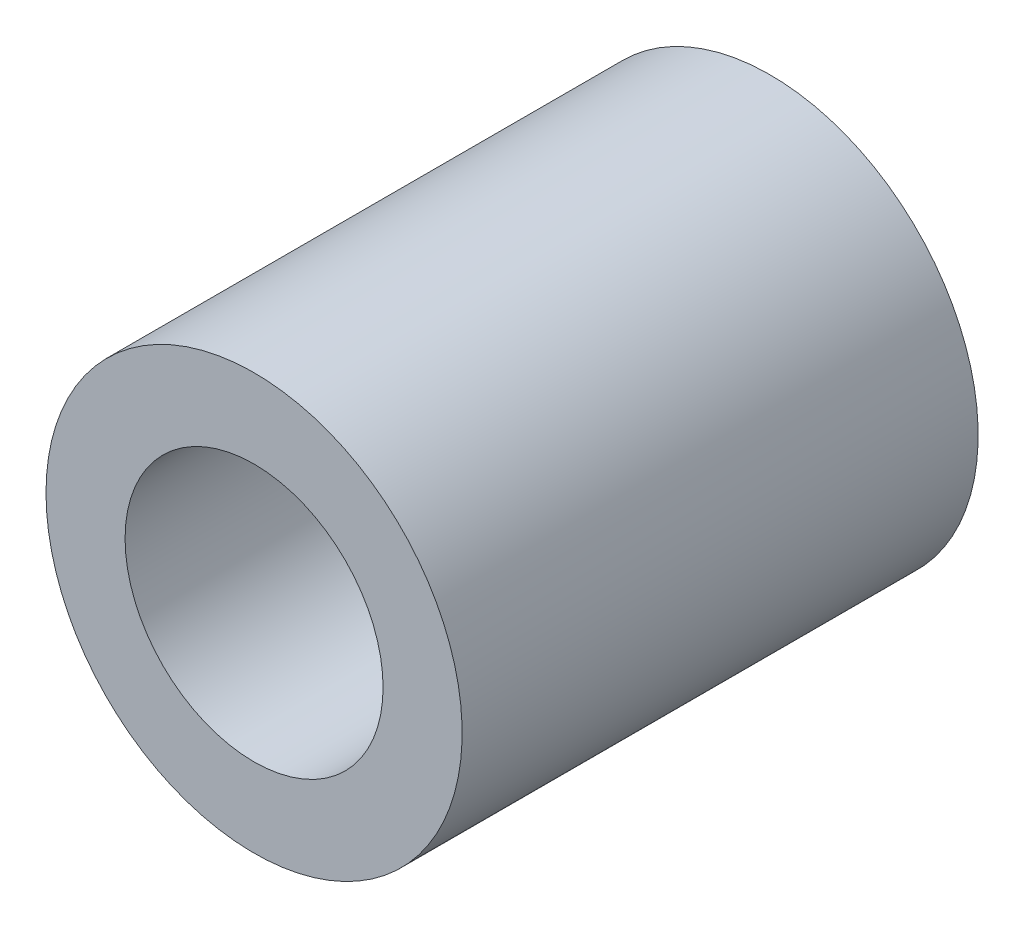
ISO-10303-21;
HEADER;
FILE_DESCRIPTION(('STEP AP214'),'2;1');
FILE_NAME('part.step','',(''),(''),'','','');
FILE_SCHEMA(('AUTOMOTIVE_DESIGN { 1 0 10303 214 1 1 1 1 }'));
ENDSEC;
DATA;
#1=APPLICATION_CONTEXT('core data for automotive mechanical design processes');
#2=APPLICATION_PROTOCOL_DEFINITION('international standard','automotive_design',2000,#1);
#3=PRODUCT_CONTEXT('',#1,'mechanical');
#4=PRODUCT('Part','Part','',(#3));
#5=PRODUCT_RELATED_PRODUCT_CATEGORY('part','',(#4));
#6=PRODUCT_DEFINITION_FORMATION('','',#4);
#7=PRODUCT_DEFINITION_CONTEXT('part definition',#1,'design');
#8=PRODUCT_DEFINITION('design','',#6,#7);
#9=PRODUCT_DEFINITION_SHAPE('','',#8);
#10=(LENGTH_UNIT() NAMED_UNIT(*) SI_UNIT(.MILLI.,.METRE.));
#11=(NAMED_UNIT(*) PLANE_ANGLE_UNIT() SI_UNIT($,.RADIAN.));
#12=(NAMED_UNIT(*) SI_UNIT($,.STERADIAN.) SOLID_ANGLE_UNIT());
#13=UNCERTAINTY_MEASURE_WITH_UNIT(LENGTH_MEASURE(1.E-05),#10,'distance_accuracy_value','');
#14=(GEOMETRIC_REPRESENTATION_CONTEXT(3) GLOBAL_UNCERTAINTY_ASSIGNED_CONTEXT((#13)) GLOBAL_UNIT_ASSIGNED_CONTEXT((#10,
#11,#12)) REPRESENTATION_CONTEXT('',''));
#15=CARTESIAN_POINT('',(0.,0.,0.));
#16=DIRECTION('',(0.,0.,1.));
#17=DIRECTION('',(1.,0.,0.));
#18=AXIS2_PLACEMENT_3D('',#15,#16,#17);
#19=CARTESIAN_POINT('',(0.,0.,6.2));
#20=DIRECTION('',(0.,0.,1.));
#21=DIRECTION('',(1.,0.,0.));
#22=AXIS2_PLACEMENT_3D('',#19,#20,#21);
#23=PLANE('',#22);
#24=CARTESIAN_POINT('',(0.,0.,6.2));
#25=DIRECTION('',(0.,0.,1.));
#26=DIRECTION('',(1.,0.,0.));
#27=AXIS2_PLACEMENT_3D('',#24,#25,#26);
#28=CIRCLE('',#27,2.5);
#29=CARTESIAN_POINT('',(-2.5,0.,6.2));
#30=VERTEX_POINT('',#29);
#31=EDGE_CURVE('E10',#30,#30,#28,.T.);
#32=ORIENTED_EDGE('',*,*,#31,.T.);
#33=EDGE_LOOP('',(#32));
#34=FACE_BOUND('',#33,.T.);
#35=CARTESIAN_POINT('',(0.,0.,6.2));
#36=DIRECTION('',(0.,0.,1.));
#37=DIRECTION('',(1.,0.,0.));
#38=AXIS2_PLACEMENT_3D('',#35,#36,#37);
#39=CIRCLE('',#38,1.55);
#40=CARTESIAN_POINT('',(-1.55,0.,6.2));
#41=VERTEX_POINT('',#40);
#42=EDGE_CURVE('E50',#41,#41,#39,.T.);
#43=ORIENTED_EDGE('',*,*,#42,.F.);
#44=EDGE_LOOP('',(#43));
#45=FACE_BOUND('',#44,.T.);
#46=ADVANCED_FACE('F37',(#34,#45),#23,.T.);
#47=CARTESIAN_POINT('',(0.,0.,0.));
#48=DIRECTION('',(0.,0.,1.));
#49=DIRECTION('',(1.,0.,0.));
#50=AXIS2_PLACEMENT_3D('',#47,#48,#49);
#51=PLANE('',#50);
#52=CARTESIAN_POINT('',(0.,0.,0.));
#53=DIRECTION('',(0.,0.,1.));
#54=DIRECTION('',(1.,0.,0.));
#55=AXIS2_PLACEMENT_3D('',#52,#53,#54);
#56=CIRCLE('',#55,2.5);
#57=CARTESIAN_POINT('',(-2.5,0.,0.));
#58=VERTEX_POINT('',#57);
#59=EDGE_CURVE('E41',#58,#58,#56,.T.);
#60=ORIENTED_EDGE('',*,*,#59,.F.);
#61=EDGE_LOOP('',(#60));
#62=FACE_BOUND('',#61,.T.);
#63=CARTESIAN_POINT('',(0.,0.,0.));
#64=DIRECTION('',(0.,0.,1.));
#65=DIRECTION('',(1.,0.,0.));
#66=AXIS2_PLACEMENT_3D('',#63,#64,#65);
#67=CIRCLE('',#66,1.55);
#68=CARTESIAN_POINT('',(-1.55,0.,0.));
#69=VERTEX_POINT('',#68);
#70=EDGE_CURVE('E52',#69,#69,#67,.T.);
#71=ORIENTED_EDGE('',*,*,#70,.T.);
#72=EDGE_LOOP('',(#71));
#73=FACE_BOUND('',#72,.T.);
#74=ADVANCED_FACE('F64',(#62,#73),#51,.F.);
#75=CARTESIAN_POINT('',(0.,0.,6.2));
#76=DIRECTION('',(0.,0.,-1.));
#77=DIRECTION('',(-1.,0.,0.));
#78=AXIS2_PLACEMENT_3D('',#75,#76,#77);
#79=CYLINDRICAL_SURFACE('',#78,2.5);
#80=CARTESIAN_POINT('',(-2.5,0.,6.2));
#81=CARTESIAN_POINT('',(-2.5,0.,6.13541666666667));
#82=CARTESIAN_POINT('',(-2.5,0.,6.07083333333333));
#83=CARTESIAN_POINT('',(-2.5,0.,5.94166666666667));
#84=CARTESIAN_POINT('',(-2.5,0.,5.87708333333333));
#85=CARTESIAN_POINT('',(-2.5,0.,5.74791666666667));
#86=CARTESIAN_POINT('',(-2.5,0.,5.68333333333333));
#87=CARTESIAN_POINT('',(-2.5,0.,5.55416666666667));
#88=CARTESIAN_POINT('',(-2.5,0.,5.48958333333333));
#89=CARTESIAN_POINT('',(-2.5,0.,5.36041666666667));
#90=CARTESIAN_POINT('',(-2.5,0.,5.29583333333333));
#91=CARTESIAN_POINT('',(-2.5,0.,5.16666666666667));
#92=CARTESIAN_POINT('',(-2.5,0.,5.10208333333333));
#93=CARTESIAN_POINT('',(-2.5,0.,4.97291666666667));
#94=CARTESIAN_POINT('',(-2.5,0.,4.90833333333333));
#95=CARTESIAN_POINT('',(-2.5,0.,4.77916666666667));
#96=CARTESIAN_POINT('',(-2.5,0.,4.71458333333333));
#97=CARTESIAN_POINT('',(-2.5,0.,4.58541666666667));
#98=CARTESIAN_POINT('',(-2.5,0.,4.52083333333333));
#99=CARTESIAN_POINT('',(-2.5,0.,4.39166666666667));
#100=CARTESIAN_POINT('',(-2.5,0.,4.32708333333333));
#101=CARTESIAN_POINT('',(-2.5,0.,4.19791666666667));
#102=CARTESIAN_POINT('',(-2.5,0.,4.13333333333333));
#103=CARTESIAN_POINT('',(-2.5,0.,4.00416666666667));
#104=CARTESIAN_POINT('',(-2.5,0.,3.93958333333333));
#105=CARTESIAN_POINT('',(-2.5,0.,3.81041666666667));
#106=CARTESIAN_POINT('',(-2.5,0.,3.74583333333333));
#107=CARTESIAN_POINT('',(-2.5,0.,3.61666666666667));
#108=CARTESIAN_POINT('',(-2.5,0.,3.55208333333333));
#109=CARTESIAN_POINT('',(-2.5,0.,3.42291666666667));
#110=CARTESIAN_POINT('',(-2.5,0.,3.35833333333333));
#111=CARTESIAN_POINT('',(-2.5,0.,3.22916666666667));
#112=CARTESIAN_POINT('',(-2.5,0.,3.16458333333333));
#113=CARTESIAN_POINT('',(-2.5,0.,3.03541666666667));
#114=CARTESIAN_POINT('',(-2.5,0.,2.97083333333333));
#115=CARTESIAN_POINT('',(-2.5,0.,2.84166666666667));
#116=CARTESIAN_POINT('',(-2.5,0.,2.77708333333333));
#117=CARTESIAN_POINT('',(-2.5,0.,2.64791666666667));
#118=CARTESIAN_POINT('',(-2.5,0.,2.58333333333333));
#119=CARTESIAN_POINT('',(-2.5,0.,2.45416666666667));
#120=CARTESIAN_POINT('',(-2.5,0.,2.38958333333333));
#121=CARTESIAN_POINT('',(-2.5,0.,2.26041666666667));
#122=CARTESIAN_POINT('',(-2.5,0.,2.19583333333333));
#123=CARTESIAN_POINT('',(-2.5,0.,2.06666666666667));
#124=CARTESIAN_POINT('',(-2.5,0.,2.00208333333333));
#125=CARTESIAN_POINT('',(-2.5,0.,1.87291666666667));
#126=CARTESIAN_POINT('',(-2.5,0.,1.80833333333333));
#127=CARTESIAN_POINT('',(-2.5,0.,1.67916666666667));
#128=CARTESIAN_POINT('',(-2.5,0.,1.61458333333333));
#129=CARTESIAN_POINT('',(-2.5,0.,1.48541666666667));
#130=CARTESIAN_POINT('',(-2.5,0.,1.42083333333333));
#131=CARTESIAN_POINT('',(-2.5,0.,1.29166666666667));
#132=CARTESIAN_POINT('',(-2.5,0.,1.22708333333333));
#133=CARTESIAN_POINT('',(-2.5,0.,1.09791666666667));
#134=CARTESIAN_POINT('',(-2.5,0.,1.03333333333333));
#135=CARTESIAN_POINT('',(-2.5,0.,0.904166666666667));
#136=CARTESIAN_POINT('',(-2.5,0.,0.839583333333333));
#137=CARTESIAN_POINT('',(-2.5,0.,0.710416666666666));
#138=CARTESIAN_POINT('',(-2.5,0.,0.645833333333333));
#139=CARTESIAN_POINT('',(-2.5,0.,0.516666666666667));
#140=CARTESIAN_POINT('',(-2.5,0.,0.452083333333333));
#141=CARTESIAN_POINT('',(-2.5,0.,0.322916666666667));
#142=CARTESIAN_POINT('',(-2.5,0.,0.258333333333334));
#143=CARTESIAN_POINT('',(-2.5,0.,0.129166666666667));
#144=CARTESIAN_POINT('',(-2.5,0.,0.0645833333333335));
#145=CARTESIAN_POINT('',(-2.5,0.,0.));
#146=B_SPLINE_CURVE_WITH_KNOTS('',3,(#80,#81,#82,#83,#84,#85,#86,#87,#88,#89,#90,#91,#92,#93,
#94,#95,#96,#97,#98,#99,#100,#101,#102,#103,#104,#105,#106,#107,#108,#109,#110,#111,#112,#113,
#114,#115,#116,#117,#118,#119,#120,#121,#122,#123,#124,#125,#126,#127,#128,#129,#130,#131,#132,
#133,#134,#135,#136,#137,#138,#139,#140,#141,#142,#143,#144,#145),.UNSPECIFIED.,.F.,.F.,(4,2,2,
2,2,2,2,2,2,2,2,2,2,2,2,2,2,2,2,2,2,2,2,2,2,2,2,2,2,2,2,2,4),(0.,0.193749999999999,0.3875,
0.581249999999999,0.775,0.968749999999999,1.1625,1.35625,1.55,1.74375,1.9375,2.13125,2.325,
2.51875,2.7125,2.90625,3.1,3.29375,3.4875,3.68125,3.875,4.06875,4.2625,4.45625,4.65,4.84375,
5.0375,5.23125,5.425,5.61875,5.8125,6.00625,6.2),.UNSPECIFIED.);
#147=EDGE_CURVE('BSEAM39',#30,#58,#146,.T.);
#148=ORIENTED_EDGE('',*,*,#31,.F.);
#149=ORIENTED_EDGE('',*,*,#59,.T.);
#150=ORIENTED_EDGE('',*,*,#147,.T.);
#151=ORIENTED_EDGE('',*,*,#147,.F.);
#152=EDGE_LOOP('',(#148,#150,#149,#151));
#153=FACE_BOUND('',#152,.T.);
#154=ADVANCED_FACE('F39',(#153),#79,.T.);
#155=CARTESIAN_POINT('',(0.,0.,6.2));
#156=DIRECTION('',(0.,0.,-1.));
#157=DIRECTION('',(-1.,0.,0.));
#158=AXIS2_PLACEMENT_3D('',#155,#156,#157);
#159=CYLINDRICAL_SURFACE('',#158,1.55);
#160=CARTESIAN_POINT('',(-1.55,0.,6.2));
#161=CARTESIAN_POINT('',(-1.55,0.,6.13541666666667));
#162=CARTESIAN_POINT('',(-1.55,0.,6.07083333333333));
#163=CARTESIAN_POINT('',(-1.55,0.,5.94166666666667));
#164=CARTESIAN_POINT('',(-1.55,0.,5.87708333333333));
#165=CARTESIAN_POINT('',(-1.55,0.,5.74791666666667));
#166=CARTESIAN_POINT('',(-1.55,0.,5.68333333333333));
#167=CARTESIAN_POINT('',(-1.55,0.,5.55416666666667));
#168=CARTESIAN_POINT('',(-1.55,0.,5.48958333333333));
#169=CARTESIAN_POINT('',(-1.55,0.,5.36041666666667));
#170=CARTESIAN_POINT('',(-1.55,0.,5.29583333333333));
#171=CARTESIAN_POINT('',(-1.55,0.,5.16666666666667));
#172=CARTESIAN_POINT('',(-1.55,0.,5.10208333333333));
#173=CARTESIAN_POINT('',(-1.55,0.,4.97291666666667));
#174=CARTESIAN_POINT('',(-1.55,0.,4.90833333333333));
#175=CARTESIAN_POINT('',(-1.55,0.,4.77916666666667));
#176=CARTESIAN_POINT('',(-1.55,0.,4.71458333333333));
#177=CARTESIAN_POINT('',(-1.55,0.,4.58541666666667));
#178=CARTESIAN_POINT('',(-1.55,0.,4.52083333333333));
#179=CARTESIAN_POINT('',(-1.55,0.,4.39166666666667));
#180=CARTESIAN_POINT('',(-1.55,0.,4.32708333333333));
#181=CARTESIAN_POINT('',(-1.55,0.,4.19791666666667));
#182=CARTESIAN_POINT('',(-1.55,0.,4.13333333333333));
#183=CARTESIAN_POINT('',(-1.55,0.,4.00416666666667));
#184=CARTESIAN_POINT('',(-1.55,0.,3.93958333333333));
#185=CARTESIAN_POINT('',(-1.55,0.,3.81041666666667));
#186=CARTESIAN_POINT('',(-1.55,0.,3.74583333333333));
#187=CARTESIAN_POINT('',(-1.55,0.,3.61666666666667));
#188=CARTESIAN_POINT('',(-1.55,0.,3.55208333333333));
#189=CARTESIAN_POINT('',(-1.55,0.,3.42291666666667));
#190=CARTESIAN_POINT('',(-1.55,0.,3.35833333333333));
#191=CARTESIAN_POINT('',(-1.55,0.,3.22916666666667));
#192=CARTESIAN_POINT('',(-1.55,0.,3.16458333333333));
#193=CARTESIAN_POINT('',(-1.55,0.,3.03541666666667));
#194=CARTESIAN_POINT('',(-1.55,0.,2.97083333333333));
#195=CARTESIAN_POINT('',(-1.55,0.,2.84166666666667));
#196=CARTESIAN_POINT('',(-1.55,0.,2.77708333333333));
#197=CARTESIAN_POINT('',(-1.55,0.,2.64791666666667));
#198=CARTESIAN_POINT('',(-1.55,0.,2.58333333333333));
#199=CARTESIAN_POINT('',(-1.55,0.,2.45416666666667));
#200=CARTESIAN_POINT('',(-1.55,0.,2.38958333333333));
#201=CARTESIAN_POINT('',(-1.55,0.,2.26041666666667));
#202=CARTESIAN_POINT('',(-1.55,0.,2.19583333333333));
#203=CARTESIAN_POINT('',(-1.55,0.,2.06666666666667));
#204=CARTESIAN_POINT('',(-1.55,0.,2.00208333333333));
#205=CARTESIAN_POINT('',(-1.55,0.,1.87291666666667));
#206=CARTESIAN_POINT('',(-1.55,0.,1.80833333333333));
#207=CARTESIAN_POINT('',(-1.55,0.,1.67916666666667));
#208=CARTESIAN_POINT('',(-1.55,0.,1.61458333333333));
#209=CARTESIAN_POINT('',(-1.55,0.,1.48541666666667));
#210=CARTESIAN_POINT('',(-1.55,0.,1.42083333333333));
#211=CARTESIAN_POINT('',(-1.55,0.,1.29166666666667));
#212=CARTESIAN_POINT('',(-1.55,0.,1.22708333333333));
#213=CARTESIAN_POINT('',(-1.55,0.,1.09791666666667));
#214=CARTESIAN_POINT('',(-1.55,0.,1.03333333333333));
#215=CARTESIAN_POINT('',(-1.55,0.,0.904166666666667));
#216=CARTESIAN_POINT('',(-1.55,0.,0.839583333333333));
#217=CARTESIAN_POINT('',(-1.55,0.,0.710416666666666));
#218=CARTESIAN_POINT('',(-1.55,0.,0.645833333333333));
#219=CARTESIAN_POINT('',(-1.55,0.,0.516666666666667));
#220=CARTESIAN_POINT('',(-1.55,0.,0.452083333333333));
#221=CARTESIAN_POINT('',(-1.55,0.,0.322916666666667));
#222=CARTESIAN_POINT('',(-1.55,0.,0.258333333333334));
#223=CARTESIAN_POINT('',(-1.55,0.,0.129166666666667));
#224=CARTESIAN_POINT('',(-1.55,0.,0.0645833333333335));
#225=CARTESIAN_POINT('',(-1.55,0.,0.));
#226=B_SPLINE_CURVE_WITH_KNOTS('',3,(#160,#161,#162,#163,#164,#165,#166,#167,#168,#169,#170,
#171,#172,#173,#174,#175,#176,#177,#178,#179,#180,#181,#182,#183,#184,#185,#186,#187,#188,#189,
#190,#191,#192,#193,#194,#195,#196,#197,#198,#199,#200,#201,#202,#203,#204,#205,#206,#207,#208,
#209,#210,#211,#212,#213,#214,#215,#216,#217,#218,#219,#220,#221,#222,#223,#224,#225),
.UNSPECIFIED.,.F.,.F.,(4,2,2,2,2,2,2,2,2,2,2,2,2,2,2,2,2,2,2,2,2,2,2,2,2,2,2,2,2,2,2,2,4),(0.,
0.19375,0.387500000000001,0.58125,0.775,0.96875,1.1625,1.35625,1.55,1.74375,1.9375,2.13125,
2.325,2.51875,2.7125,2.90625,3.1,3.29375,3.4875,3.68125,3.875,4.06875,4.2625,4.45625,4.65,
4.84375,5.0375,5.23125,5.425,5.61875,5.8125,6.00625,6.2),.UNSPECIFIED.);
#227=EDGE_CURVE('BSEAM60',#41,#69,#226,.T.);
#228=ORIENTED_EDGE('',*,*,#42,.T.);
#229=ORIENTED_EDGE('',*,*,#70,.F.);
#230=ORIENTED_EDGE('',*,*,#227,.T.);
#231=ORIENTED_EDGE('',*,*,#227,.F.);
#232=EDGE_LOOP('',(#228,#230,#229,#231));
#233=FACE_BOUND('',#232,.T.);
#234=ADVANCED_FACE('F60',(#233),#159,.F.);
#235=CLOSED_SHELL('',(#46,#74,#154,#234));
#236=MANIFOLD_SOLID_BREP('B2',#235);
#237=ADVANCED_BREP_SHAPE_REPRESENTATION('',(#18,#236),#14);
#238=SHAPE_DEFINITION_REPRESENTATION(#9,#237);
ENDSEC;
END-ISO-10303-21;
